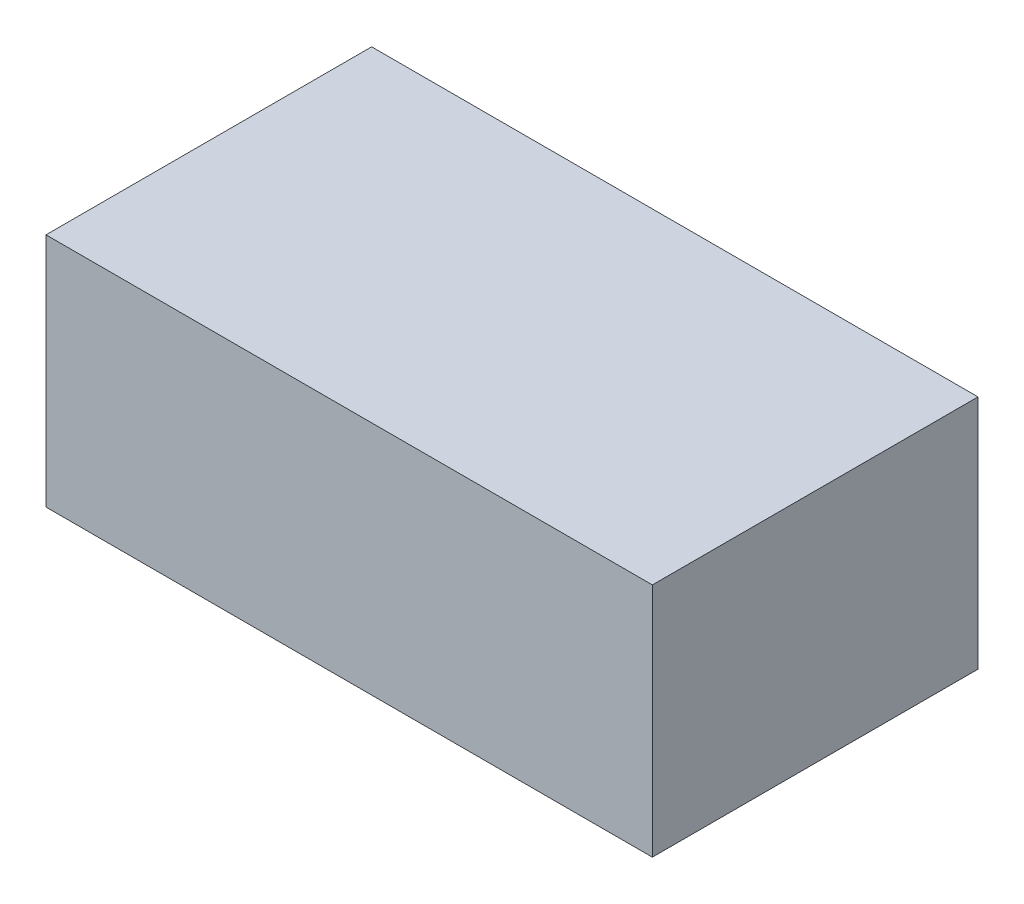
ISO-10303-21;
HEADER;
FILE_DESCRIPTION(('STEP AP214'),'2;1');
FILE_NAME('part.step','',(''),(''),'','','');
FILE_SCHEMA(('AUTOMOTIVE_DESIGN { 1 0 10303 214 1 1 1 1 }'));
ENDSEC;
DATA;
#1=APPLICATION_CONTEXT('core data for automotive mechanical design processes');
#2=APPLICATION_PROTOCOL_DEFINITION('international standard','automotive_design',2000,#1);
#3=PRODUCT_CONTEXT('',#1,'mechanical');
#4=PRODUCT('Part','Part','',(#3));
#5=PRODUCT_RELATED_PRODUCT_CATEGORY('part','',(#4));
#6=PRODUCT_DEFINITION_FORMATION('','',#4);
#7=PRODUCT_DEFINITION_CONTEXT('part definition',#1,'design');
#8=PRODUCT_DEFINITION('design','',#6,#7);
#9=PRODUCT_DEFINITION_SHAPE('','',#8);
#10=(LENGTH_UNIT() NAMED_UNIT(*) SI_UNIT(.MILLI.,.METRE.));
#11=(NAMED_UNIT(*) PLANE_ANGLE_UNIT() SI_UNIT($,.RADIAN.));
#12=(NAMED_UNIT(*) SI_UNIT($,.STERADIAN.) SOLID_ANGLE_UNIT());
#13=UNCERTAINTY_MEASURE_WITH_UNIT(LENGTH_MEASURE(1.E-05),#10,'distance_accuracy_value','');
#14=(GEOMETRIC_REPRESENTATION_CONTEXT(3) GLOBAL_UNCERTAINTY_ASSIGNED_CONTEXT((#13)) GLOBAL_UNIT_ASSIGNED_CONTEXT((#10,
#11,#12)) REPRESENTATION_CONTEXT('',''));
#15=CARTESIAN_POINT('',(0.,0.,0.));
#16=DIRECTION('',(0.,0.,1.));
#17=DIRECTION('',(1.,0.,0.));
#18=AXIS2_PLACEMENT_3D('',#15,#16,#17);
#19=CARTESIAN_POINT('',(0.,21.,0.));
#20=DIRECTION('',(1.,0.,0.));
#21=DIRECTION('',(0.,0.,-1.));
#22=AXIS2_PLACEMENT_3D('',#19,#20,#21);
#23=PLANE('',#22);
#24=DIRECTION('',(0.,0.,1.));
#25=VECTOR('',#24,1.);
#26=CARTESIAN_POINT('',(0.,0.,0.));
#27=LINE('',#26,#25);
#28=CARTESIAN_POINT('',(0.,0.,-29.));
#29=VERTEX_POINT('',#28);
#30=CARTESIAN_POINT('',(0.,0.,0.));
#31=VERTEX_POINT('',#30);
#32=EDGE_CURVE('E107',#29,#31,#27,.T.);
#33=ORIENTED_EDGE('',*,*,#32,.T.);
#34=DIRECTION('',(0.,-1.,0.));
#35=VECTOR('',#34,1.);
#36=CARTESIAN_POINT('',(0.,21.,0.));
#37=LINE('',#36,#35);
#38=CARTESIAN_POINT('',(0.,21.,0.));
#39=VERTEX_POINT('',#38);
#40=EDGE_CURVE('E11',#39,#31,#37,.T.);
#41=ORIENTED_EDGE('',*,*,#40,.F.);
#42=DIRECTION('',(0.,0.,1.));
#43=VECTOR('',#42,1.);
#44=CARTESIAN_POINT('',(0.,21.,0.));
#45=LINE('',#44,#43);
#46=CARTESIAN_POINT('',(0.,21.,-29.));
#47=VERTEX_POINT('',#46);
#48=EDGE_CURVE('E91',#47,#39,#45,.T.);
#49=ORIENTED_EDGE('',*,*,#48,.F.);
#50=DIRECTION('',(0.,-1.,0.));
#51=VECTOR('',#50,1.);
#52=CARTESIAN_POINT('',(0.,21.,-29.));
#53=LINE('',#52,#51);
#54=EDGE_CURVE('E103',#47,#29,#53,.T.);
#55=ORIENTED_EDGE('',*,*,#54,.T.);
#56=EDGE_LOOP('',(#33,#41,#49,#55));
#57=FACE_BOUND('',#56,.T.);
#58=ADVANCED_FACE('F39',(#57),#23,.F.);
#59=CARTESIAN_POINT('',(0.,21.,0.));
#60=DIRECTION('',(0.,0.,-1.));
#61=DIRECTION('',(-1.,0.,0.));
#62=AXIS2_PLACEMENT_3D('',#59,#60,#61);
#63=PLANE('',#62);
#64=DIRECTION('',(1.,0.,0.));
#65=VECTOR('',#64,1.);
#66=CARTESIAN_POINT('',(0.,0.,0.));
#67=LINE('',#66,#65);
#68=CARTESIAN_POINT('',(54.,0.,0.));
#69=VERTEX_POINT('',#68);
#70=EDGE_CURVE('E96',#31,#69,#67,.T.);
#71=ORIENTED_EDGE('',*,*,#70,.T.);
#72=DIRECTION('',(0.,-1.,0.));
#73=VECTOR('',#72,1.);
#74=CARTESIAN_POINT('',(54.,21.,0.));
#75=LINE('',#74,#73);
#76=CARTESIAN_POINT('',(54.,21.,0.));
#77=VERTEX_POINT('',#76);
#78=EDGE_CURVE('E48',#77,#69,#75,.T.);
#79=ORIENTED_EDGE('',*,*,#78,.F.);
#80=DIRECTION('',(1.,0.,0.));
#81=VECTOR('',#80,1.);
#82=CARTESIAN_POINT('',(0.,21.,0.));
#83=LINE('',#82,#81);
#84=EDGE_CURVE('E86',#39,#77,#83,.T.);
#85=ORIENTED_EDGE('',*,*,#84,.F.);
#86=ORIENTED_EDGE('',*,*,#40,.T.);
#87=EDGE_LOOP('',(#71,#79,#85,#86));
#88=FACE_BOUND('',#87,.T.);
#89=ADVANCED_FACE('F95',(#88),#63,.F.);
#90=CARTESIAN_POINT('',(54.,21.,0.));
#91=DIRECTION('',(-1.,0.,0.));
#92=DIRECTION('',(0.,0.,1.));
#93=AXIS2_PLACEMENT_3D('',#90,#91,#92);
#94=PLANE('',#93);
#95=DIRECTION('',(0.,0.,-1.));
#96=VECTOR('',#95,1.);
#97=CARTESIAN_POINT('',(54.,0.,0.));
#98=LINE('',#97,#96);
#99=CARTESIAN_POINT('',(54.,0.,-29.));
#100=VERTEX_POINT('',#99);
#101=EDGE_CURVE('E73',#69,#100,#98,.T.);
#102=ORIENTED_EDGE('',*,*,#101,.T.);
#103=DIRECTION('',(0.,-1.,0.));
#104=VECTOR('',#103,1.);
#105=CARTESIAN_POINT('',(54.,21.,-29.));
#106=LINE('',#105,#104);
#107=CARTESIAN_POINT('',(54.,21.,-29.));
#108=VERTEX_POINT('',#107);
#109=EDGE_CURVE('E98',#108,#100,#106,.T.);
#110=ORIENTED_EDGE('',*,*,#109,.F.);
#111=DIRECTION('',(0.,0.,-1.));
#112=VECTOR('',#111,1.);
#113=CARTESIAN_POINT('',(54.,21.,0.));
#114=LINE('',#113,#112);
#115=EDGE_CURVE('E89',#77,#108,#114,.T.);
#116=ORIENTED_EDGE('',*,*,#115,.F.);
#117=ORIENTED_EDGE('',*,*,#78,.T.);
#118=EDGE_LOOP('',(#102,#110,#116,#117));
#119=FACE_BOUND('',#118,.T.);
#120=ADVANCED_FACE('F99',(#119),#94,.F.);
#121=CARTESIAN_POINT('',(0.,21.,-29.));
#122=DIRECTION('',(0.,0.,1.));
#123=DIRECTION('',(1.,0.,0.));
#124=AXIS2_PLACEMENT_3D('',#121,#122,#123);
#125=PLANE('',#124);
#126=DIRECTION('',(-1.,0.,0.));
#127=VECTOR('',#126,1.);
#128=CARTESIAN_POINT('',(0.,0.,-29.));
#129=LINE('',#128,#127);
#130=EDGE_CURVE('E79',#100,#29,#129,.T.);
#131=ORIENTED_EDGE('',*,*,#130,.T.);
#132=ORIENTED_EDGE('',*,*,#54,.F.);
#133=DIRECTION('',(-1.,0.,0.));
#134=VECTOR('',#133,1.);
#135=CARTESIAN_POINT('',(0.,21.,-29.));
#136=LINE('',#135,#134);
#137=EDGE_CURVE('E56',#108,#47,#136,.T.);
#138=ORIENTED_EDGE('',*,*,#137,.F.);
#139=ORIENTED_EDGE('',*,*,#109,.T.);
#140=EDGE_LOOP('',(#131,#132,#138,#139));
#141=FACE_BOUND('',#140,.T.);
#142=ADVANCED_FACE('F120',(#141),#125,.F.);
#143=CARTESIAN_POINT('',(0.,21.,0.));
#144=DIRECTION('',(0.,-1.,0.));
#145=DIRECTION('',(0.,0.,-1.));
#146=AXIS2_PLACEMENT_3D('',#143,#144,#145);
#147=PLANE('',#146);
#148=ORIENTED_EDGE('',*,*,#48,.T.);
#149=ORIENTED_EDGE('',*,*,#84,.T.);
#150=ORIENTED_EDGE('',*,*,#115,.T.);
#151=ORIENTED_EDGE('',*,*,#137,.T.);
#152=EDGE_LOOP('',(#148,#149,#150,#151));
#153=FACE_BOUND('',#152,.T.);
#154=ADVANCED_FACE('F87',(#153),#147,.F.);
#155=CARTESIAN_POINT('',(0.,0.,0.));
#156=DIRECTION('',(0.,-1.,0.));
#157=DIRECTION('',(0.,0.,-1.));
#158=AXIS2_PLACEMENT_3D('',#155,#156,#157);
#159=PLANE('',#158);
#160=ORIENTED_EDGE('',*,*,#32,.F.);
#161=ORIENTED_EDGE('',*,*,#130,.F.);
#162=ORIENTED_EDGE('',*,*,#101,.F.);
#163=ORIENTED_EDGE('',*,*,#70,.F.);
#164=EDGE_LOOP('',(#160,#161,#162,#163));
#165=FACE_BOUND('',#164,.T.);
#166=ADVANCED_FACE('F123',(#165),#159,.T.);
#167=CLOSED_SHELL('',(#58,#89,#120,#142,#154,#166));
#168=MANIFOLD_SOLID_BREP('B2',#167);
#169=ADVANCED_BREP_SHAPE_REPRESENTATION('',(#18,#168),#14);
#170=SHAPE_DEFINITION_REPRESENTATION(#9,#169);
ENDSEC;
END-ISO-10303-21;
